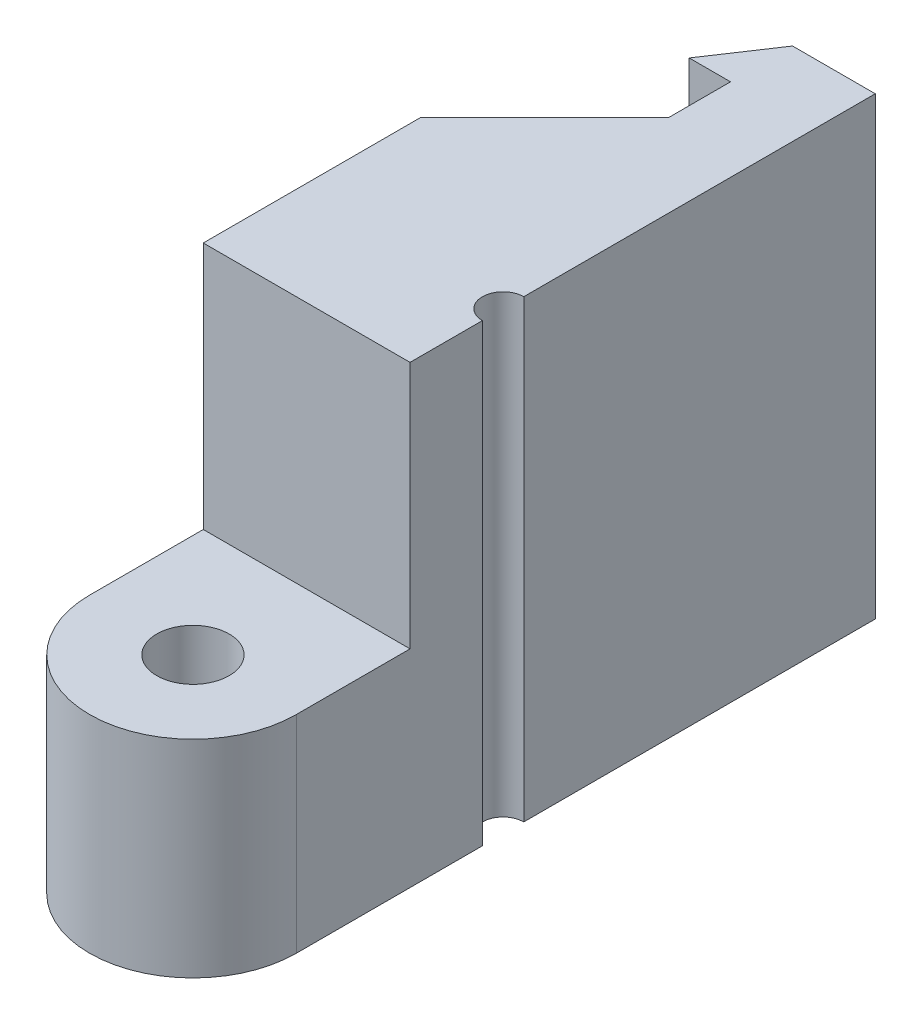
ISO-10303-21;
HEADER;
FILE_DESCRIPTION(('STEP AP214'),'2;1');
FILE_NAME('part.step','',(''),(''),'','','');
FILE_SCHEMA(('AUTOMOTIVE_DESIGN { 1 0 10303 214 1 1 1 1 }'));
ENDSEC;
DATA;
#1=APPLICATION_CONTEXT('core data for automotive mechanical design processes');
#2=APPLICATION_PROTOCOL_DEFINITION('international standard','automotive_design',2000,#1);
#3=PRODUCT_CONTEXT('',#1,'mechanical');
#4=PRODUCT('Part','Part','',(#3));
#5=PRODUCT_RELATED_PRODUCT_CATEGORY('part','',(#4));
#6=PRODUCT_DEFINITION_FORMATION('','',#4);
#7=PRODUCT_DEFINITION_CONTEXT('part definition',#1,'design');
#8=PRODUCT_DEFINITION('design','',#6,#7);
#9=PRODUCT_DEFINITION_SHAPE('','',#8);
#10=(LENGTH_UNIT() NAMED_UNIT(*) SI_UNIT(.MILLI.,.METRE.));
#11=(NAMED_UNIT(*) PLANE_ANGLE_UNIT() SI_UNIT($,.RADIAN.));
#12=(NAMED_UNIT(*) SI_UNIT($,.STERADIAN.) SOLID_ANGLE_UNIT());
#13=UNCERTAINTY_MEASURE_WITH_UNIT(LENGTH_MEASURE(1.E-05),#10,'distance_accuracy_value','');
#14=(GEOMETRIC_REPRESENTATION_CONTEXT(3) GLOBAL_UNCERTAINTY_ASSIGNED_CONTEXT((#13)) GLOBAL_UNIT_ASSIGNED_CONTEXT((#10,
#11,#12)) REPRESENTATION_CONTEXT('',''));
#15=CARTESIAN_POINT('',(0.,0.,0.));
#16=DIRECTION('',(0.,0.,1.));
#17=DIRECTION('',(1.,0.,0.));
#18=AXIS2_PLACEMENT_3D('',#15,#16,#17);
#19=CARTESIAN_POINT('',(5.,10.,-10.));
#20=DIRECTION('',(0.,-1.,0.));
#21=DIRECTION('',(0.,0.,-1.));
#22=AXIS2_PLACEMENT_3D('',#19,#20,#21);
#23=CYLINDRICAL_SURFACE('',#22,0.999999999999997);
#24=CARTESIAN_POINT('',(5.,0.,-10.));
#25=DIRECTION('',(0.,1.,0.));
#26=DIRECTION('',(0.,0.,1.));
#27=AXIS2_PLACEMENT_3D('',#24,#25,#26);
#28=CIRCLE('',#27,0.999999999999997);
#29=CARTESIAN_POINT('',(5.,0.,-11.));
#30=VERTEX_POINT('',#29);
#31=CARTESIAN_POINT('',(5.,0.,-9.));
#32=VERTEX_POINT('',#31);
#33=EDGE_CURVE('E214',#30,#32,#28,.T.);
#34=ORIENTED_EDGE('',*,*,#33,.F.);
#35=DIRECTION('',(0.,-1.,0.));
#36=VECTOR('',#35,1.);
#37=CARTESIAN_POINT('',(5.,10.,-11.));
#38=LINE('',#37,#36);
#39=CARTESIAN_POINT('',(5.,22.,-11.));
#40=VERTEX_POINT('',#39);
#41=EDGE_CURVE('E259',#40,#30,#38,.T.);
#42=ORIENTED_EDGE('',*,*,#41,.F.);
#43=CARTESIAN_POINT('',(5.,22.,-10.));
#44=DIRECTION('',(0.,-1.,0.));
#45=DIRECTION('',(0.,0.,1.));
#46=AXIS2_PLACEMENT_3D('',#43,#44,#45);
#47=CIRCLE('',#46,0.999999999999997);
#48=CARTESIAN_POINT('',(5.,22.,-9.));
#49=VERTEX_POINT('',#48);
#50=EDGE_CURVE('E145',#49,#40,#47,.T.);
#51=ORIENTED_EDGE('',*,*,#50,.F.);
#52=DIRECTION('',(0.,-1.,0.));
#53=VECTOR('',#52,1.);
#54=CARTESIAN_POINT('',(5.,10.,-9.));
#55=LINE('',#54,#53);
#56=EDGE_CURVE('E230',#49,#32,#55,.T.);
#57=ORIENTED_EDGE('',*,*,#56,.T.);
#58=EDGE_LOOP('',(#34,#42,#51,#57));
#59=FACE_BOUND('',#58,.T.);
#60=ADVANCED_FACE('F47',(#59),#23,.F.);
#61=CARTESIAN_POINT('',(5.,10.,0.));
#62=DIRECTION('',(-1.,0.,0.));
#63=DIRECTION('',(0.,0.,1.));
#64=AXIS2_PLACEMENT_3D('',#61,#62,#63);
#65=PLANE('',#64);
#66=DIRECTION('',(0.,0.,-1.));
#67=VECTOR('',#66,1.);
#68=CARTESIAN_POINT('',(5.,0.,0.));
#69=LINE('',#68,#67);
#70=CARTESIAN_POINT('',(5.,0.,-28.));
#71=VERTEX_POINT('',#70);
#72=EDGE_CURVE('E154',#30,#71,#69,.T.);
#73=ORIENTED_EDGE('',*,*,#72,.T.);
#74=DIRECTION('',(0.,1.,0.));
#75=VECTOR('',#74,1.);
#76=CARTESIAN_POINT('',(5.,-8.48528137423857,-28.));
#77=LINE('',#76,#75);
#78=CARTESIAN_POINT('',(5.,22.,-28.));
#79=VERTEX_POINT('',#78);
#80=EDGE_CURVE('E151',#71,#79,#77,.T.);
#81=ORIENTED_EDGE('',*,*,#80,.T.);
#82=DIRECTION('',(0.,0.,-1.));
#83=VECTOR('',#82,1.);
#84=CARTESIAN_POINT('',(5.,22.,-11.));
#85=LINE('',#84,#83);
#86=EDGE_CURVE('E137',#40,#79,#85,.T.);
#87=ORIENTED_EDGE('',*,*,#86,.F.);
#88=ORIENTED_EDGE('',*,*,#41,.T.);
#89=EDGE_LOOP('',(#73,#81,#87,#88));
#90=FACE_BOUND('',#89,.T.);
#91=ADVANCED_FACE('F152',(#90),#65,.F.);
#92=CARTESIAN_POINT('',(-5.,10.,0.));
#93=DIRECTION('',(-1.,0.,0.));
#94=DIRECTION('',(0.,0.,1.));
#95=AXIS2_PLACEMENT_3D('',#92,#93,#94);
#96=PLANE('',#95);
#97=DIRECTION('',(0.,0.,1.));
#98=VECTOR('',#97,1.);
#99=CARTESIAN_POINT('',(-5.,22.,-5.5));
#100=LINE('',#99,#98);
#101=CARTESIAN_POINT('',(-5.,22.,-16.));
#102=VERTEX_POINT('',#101);
#103=CARTESIAN_POINT('',(-5.,22.,-5.5));
#104=VERTEX_POINT('',#103);
#105=EDGE_CURVE('E148',#102,#104,#100,.T.);
#106=ORIENTED_EDGE('',*,*,#105,.F.);
#107=DIRECTION('',(0.,-1.,0.));
#108=VECTOR('',#107,1.);
#109=CARTESIAN_POINT('',(-5.,10.,-16.));
#110=LINE('',#109,#108);
#111=CARTESIAN_POINT('',(-5.,0.,-16.));
#112=VERTEX_POINT('',#111);
#113=EDGE_CURVE('E262',#102,#112,#110,.T.);
#114=ORIENTED_EDGE('',*,*,#113,.T.);
#115=DIRECTION('',(0.,0.,-1.));
#116=VECTOR('',#115,1.);
#117=CARTESIAN_POINT('',(-5.,0.,0.));
#118=LINE('',#117,#116);
#119=CARTESIAN_POINT('',(-5.,0.,0.));
#120=VERTEX_POINT('',#119);
#121=EDGE_CURVE('E236',#120,#112,#118,.T.);
#122=ORIENTED_EDGE('',*,*,#121,.F.);
#123=DIRECTION('',(0.,-1.,0.));
#124=VECTOR('',#123,1.);
#125=CARTESIAN_POINT('',(-5.,10.,0.));
#126=LINE('',#125,#124);
#127=CARTESIAN_POINT('',(-5.,10.,0.));
#128=VERTEX_POINT('',#127);
#129=EDGE_CURVE('E256',#128,#120,#126,.T.);
#130=ORIENTED_EDGE('',*,*,#129,.F.);
#131=DIRECTION('',(0.,0.,-1.));
#132=VECTOR('',#131,1.);
#133=CARTESIAN_POINT('',(-5.,10.,0.));
#134=LINE('',#133,#132);
#135=CARTESIAN_POINT('',(-5.,10.,-5.5));
#136=VERTEX_POINT('',#135);
#137=EDGE_CURVE('E215',#128,#136,#134,.T.);
#138=ORIENTED_EDGE('',*,*,#137,.T.);
#139=DIRECTION('',(0.,-1.,0.));
#140=VECTOR('',#139,1.);
#141=CARTESIAN_POINT('',(-5.,22.,-5.5));
#142=LINE('',#141,#140);
#143=EDGE_CURVE('E210',#104,#136,#142,.T.);
#144=ORIENTED_EDGE('',*,*,#143,.F.);
#145=EDGE_LOOP('',(#106,#114,#122,#130,#138,#144));
#146=FACE_BOUND('',#145,.T.);
#147=ADVANCED_FACE('F279',(#146),#96,.T.);
#148=CARTESIAN_POINT('',(0.,10.,0.));
#149=DIRECTION('',(0.,-1.,0.));
#150=DIRECTION('',(0.,0.,-1.));
#151=AXIS2_PLACEMENT_3D('',#148,#149,#150);
#152=CYLINDRICAL_SURFACE('',#151,5.);
#153=CARTESIAN_POINT('',(0.,0.,0.));
#154=DIRECTION('',(0.,1.,0.));
#155=DIRECTION('',(0.,0.,1.));
#156=AXIS2_PLACEMENT_3D('',#153,#154,#155);
#157=CIRCLE('',#156,5.);
#158=CARTESIAN_POINT('',(5.,0.,0.));
#159=VERTEX_POINT('',#158);
#160=EDGE_CURVE('E240',#120,#159,#157,.T.);
#161=ORIENTED_EDGE('',*,*,#160,.T.);
#162=DIRECTION('',(0.,-1.,0.));
#163=VECTOR('',#162,1.);
#164=CARTESIAN_POINT('',(5.,10.,0.));
#165=LINE('',#164,#163);
#166=CARTESIAN_POINT('',(5.,10.,0.));
#167=VERTEX_POINT('',#166);
#168=EDGE_CURVE('E252',#167,#159,#165,.T.);
#169=ORIENTED_EDGE('',*,*,#168,.F.);
#170=CARTESIAN_POINT('',(0.,10.,0.));
#171=DIRECTION('',(0.,1.,0.));
#172=DIRECTION('',(0.,0.,1.));
#173=AXIS2_PLACEMENT_3D('',#170,#171,#172);
#174=CIRCLE('',#173,5.);
#175=EDGE_CURVE('E219',#128,#167,#174,.T.);
#176=ORIENTED_EDGE('',*,*,#175,.F.);
#177=ORIENTED_EDGE('',*,*,#129,.T.);
#178=EDGE_LOOP('',(#161,#169,#176,#177));
#179=FACE_BOUND('',#178,.T.);
#180=ADVANCED_FACE('F321',(#179),#152,.T.);
#181=CARTESIAN_POINT('',(5.,10.,0.));
#182=DIRECTION('',(-1.,0.,0.));
#183=DIRECTION('',(0.,0.,1.));
#184=AXIS2_PLACEMENT_3D('',#181,#182,#183);
#185=PLANE('',#184);
#186=DIRECTION('',(0.,0.,-1.));
#187=VECTOR('',#186,1.);
#188=CARTESIAN_POINT('',(5.,0.,0.));
#189=LINE('',#188,#187);
#190=EDGE_CURVE('E243',#159,#32,#189,.T.);
#191=ORIENTED_EDGE('',*,*,#190,.T.);
#192=ORIENTED_EDGE('',*,*,#56,.F.);
#193=DIRECTION('',(0.,0.,-1.));
#194=VECTOR('',#193,1.);
#195=CARTESIAN_POINT('',(5.,22.,-5.5));
#196=LINE('',#195,#194);
#197=CARTESIAN_POINT('',(5.,22.,-5.5));
#198=VERTEX_POINT('',#197);
#199=EDGE_CURVE('E192',#198,#49,#196,.T.);
#200=ORIENTED_EDGE('',*,*,#199,.F.);
#201=DIRECTION('',(0.,-1.,0.));
#202=VECTOR('',#201,1.);
#203=CARTESIAN_POINT('',(5.,22.,-5.5));
#204=LINE('',#203,#202);
#205=CARTESIAN_POINT('',(5.,10.,-5.5));
#206=VERTEX_POINT('',#205);
#207=EDGE_CURVE('E203',#198,#206,#204,.T.);
#208=ORIENTED_EDGE('',*,*,#207,.T.);
#209=DIRECTION('',(0.,0.,-1.));
#210=VECTOR('',#209,1.);
#211=CARTESIAN_POINT('',(5.,10.,0.));
#212=LINE('',#211,#210);
#213=EDGE_CURVE('E223',#167,#206,#212,.T.);
#214=ORIENTED_EDGE('',*,*,#213,.F.);
#215=ORIENTED_EDGE('',*,*,#168,.T.);
#216=EDGE_LOOP('',(#191,#192,#200,#208,#214,#215));
#217=FACE_BOUND('',#216,.T.);
#218=ADVANCED_FACE('F288',(#217),#185,.F.);
#219=CARTESIAN_POINT('',(0.,10.,0.));
#220=DIRECTION('',(0.,-1.,0.));
#221=DIRECTION('',(0.,0.,-1.));
#222=AXIS2_PLACEMENT_3D('',#219,#220,#221);
#223=CYLINDRICAL_SURFACE('',#222,1.75);
#224=CARTESIAN_POINT('',(0.,10.,0.));
#225=DIRECTION('',(0.,1.,0.));
#226=DIRECTION('',(0.,0.,1.));
#227=AXIS2_PLACEMENT_3D('',#224,#225,#226);
#228=CIRCLE('',#227,1.75);
#229=CARTESIAN_POINT('',(0.,10.,1.75));
#230=VERTEX_POINT('',#229);
#231=EDGE_CURVE('E226',#230,#230,#228,.T.);
#232=ORIENTED_EDGE('',*,*,#231,.T.);
#233=EDGE_LOOP('',(#232));
#234=FACE_BOUND('',#233,.T.);
#235=CARTESIAN_POINT('',(0.,0.,0.));
#236=DIRECTION('',(0.,1.,0.));
#237=DIRECTION('',(0.,0.,1.));
#238=AXIS2_PLACEMENT_3D('',#235,#236,#237);
#239=CIRCLE('',#238,1.75);
#240=CARTESIAN_POINT('',(0.,0.,1.75));
#241=VERTEX_POINT('',#240);
#242=EDGE_CURVE('E220',#241,#241,#239,.T.);
#243=ORIENTED_EDGE('',*,*,#242,.F.);
#244=EDGE_LOOP('',(#243));
#245=FACE_BOUND('',#244,.T.);
#246=ADVANCED_FACE('F327',(#234,#245),#223,.F.);
#247=CARTESIAN_POINT('',(0.,10.,0.));
#248=DIRECTION('',(0.,1.,0.));
#249=DIRECTION('',(0.,0.,1.));
#250=AXIS2_PLACEMENT_3D('',#247,#248,#249);
#251=PLANE('',#250);
#252=DIRECTION('',(1.,0.,0.));
#253=VECTOR('',#252,1.);
#254=CARTESIAN_POINT('',(5.,10.,-5.5));
#255=LINE('',#254,#253);
#256=EDGE_CURVE('E195',#136,#206,#255,.T.);
#257=ORIENTED_EDGE('',*,*,#256,.F.);
#258=ORIENTED_EDGE('',*,*,#137,.F.);
#259=ORIENTED_EDGE('',*,*,#175,.T.);
#260=ORIENTED_EDGE('',*,*,#213,.T.);
#261=EDGE_LOOP('',(#257,#258,#259,#260));
#262=FACE_BOUND('',#261,.T.);
#263=ORIENTED_EDGE('',*,*,#231,.F.);
#264=EDGE_LOOP('',(#263));
#265=FACE_BOUND('',#264,.T.);
#266=ADVANCED_FACE('F330',(#262,#265),#251,.T.);
#267=CARTESIAN_POINT('',(0.,0.,0.));
#268=DIRECTION('',(0.,1.,0.));
#269=DIRECTION('',(0.,0.,1.));
#270=AXIS2_PLACEMENT_3D('',#267,#268,#269);
#271=PLANE('',#270);
#272=ORIENTED_EDGE('',*,*,#121,.T.);
#273=DIRECTION('',(-0.707106781186549,0.,0.707106781186546));
#274=VECTOR('',#273,1.);
#275=CARTESIAN_POINT('',(-5.,0.,-16.));
#276=LINE('',#275,#274);
#277=CARTESIAN_POINT('',(1.,0.,-22.));
#278=VERTEX_POINT('',#277);
#279=EDGE_CURVE('E57',#112,#278,#276,.F.);
#280=ORIENTED_EDGE('',*,*,#279,.T.);
#281=DIRECTION('',(0.,0.,-1.));
#282=VECTOR('',#281,1.);
#283=CARTESIAN_POINT('',(0.999999999999999,0.,-25.));
#284=LINE('',#283,#282);
#285=CARTESIAN_POINT('',(0.999999999999999,0.,-25.));
#286=VERTEX_POINT('',#285);
#287=EDGE_CURVE('E172',#278,#286,#284,.T.);
#288=ORIENTED_EDGE('',*,*,#287,.T.);
#289=DIRECTION('',(-1.,0.,0.));
#290=VECTOR('',#289,1.);
#291=CARTESIAN_POINT('',(-1.,0.,-25.));
#292=LINE('',#291,#290);
#293=CARTESIAN_POINT('',(-1.,0.,-25.));
#294=VERTEX_POINT('',#293);
#295=EDGE_CURVE('E277',#286,#294,#292,.T.);
#296=ORIENTED_EDGE('',*,*,#295,.T.);
#297=DIRECTION('',(0.554700196225229,0.,-0.832050294337844));
#298=VECTOR('',#297,1.);
#299=CARTESIAN_POINT('',(0.999999999999999,0.,-28.));
#300=LINE('',#299,#298);
#301=CARTESIAN_POINT('',(0.999999999999999,0.,-28.));
#302=VERTEX_POINT('',#301);
#303=EDGE_CURVE('E293',#294,#302,#300,.T.);
#304=ORIENTED_EDGE('',*,*,#303,.T.);
#305=DIRECTION('',(1.,0.,0.));
#306=VECTOR('',#305,1.);
#307=CARTESIAN_POINT('',(5.,0.,-28.));
#308=LINE('',#307,#306);
#309=EDGE_CURVE('E183',#302,#71,#308,.T.);
#310=ORIENTED_EDGE('',*,*,#309,.T.);
#311=ORIENTED_EDGE('',*,*,#72,.F.);
#312=ORIENTED_EDGE('',*,*,#33,.T.);
#313=ORIENTED_EDGE('',*,*,#190,.F.);
#314=ORIENTED_EDGE('',*,*,#160,.F.);
#315=EDGE_LOOP('',(#272,#280,#288,#296,#304,#310,#311,#312,#313,#314));
#316=FACE_BOUND('',#315,.T.);
#317=ORIENTED_EDGE('',*,*,#242,.T.);
#318=EDGE_LOOP('',(#317));
#319=FACE_BOUND('',#318,.T.);
#320=ADVANCED_FACE('F267',(#316,#319),#271,.F.);
#321=CARTESIAN_POINT('',(5.,22.,-5.5));
#322=DIRECTION('',(0.,0.,-1.));
#323=DIRECTION('',(-1.,0.,0.));
#324=AXIS2_PLACEMENT_3D('',#321,#322,#323);
#325=PLANE('',#324);
#326=ORIENTED_EDGE('',*,*,#256,.T.);
#327=ORIENTED_EDGE('',*,*,#207,.F.);
#328=DIRECTION('',(1.,0.,0.));
#329=VECTOR('',#328,1.);
#330=CARTESIAN_POINT('',(5.,22.,-5.5));
#331=LINE('',#330,#329);
#332=EDGE_CURVE('E200',#104,#198,#331,.T.);
#333=ORIENTED_EDGE('',*,*,#332,.F.);
#334=ORIENTED_EDGE('',*,*,#143,.T.);
#335=EDGE_LOOP('',(#326,#327,#333,#334));
#336=FACE_BOUND('',#335,.T.);
#337=ADVANCED_FACE('F285',(#336),#325,.F.);
#338=CARTESIAN_POINT('',(5.,22.,-10.));
#339=DIRECTION('',(0.,1.,0.));
#340=DIRECTION('',(0.,0.,1.));
#341=AXIS2_PLACEMENT_3D('',#338,#339,#340);
#342=PLANE('',#341);
#343=DIRECTION('',(0.,0.,1.));
#344=VECTOR('',#343,1.);
#345=CARTESIAN_POINT('',(0.999999999999999,22.,-25.));
#346=LINE('',#345,#344);
#347=CARTESIAN_POINT('',(0.999999999999999,22.,-25.));
#348=VERTEX_POINT('',#347);
#349=CARTESIAN_POINT('',(1.,22.,-22.));
#350=VERTEX_POINT('',#349);
#351=EDGE_CURVE('E160',#348,#350,#346,.T.);
#352=ORIENTED_EDGE('',*,*,#351,.T.);
#353=DIRECTION('',(0.707106781186549,0.,-0.707106781186546));
#354=VECTOR('',#353,1.);
#355=CARTESIAN_POINT('',(-2.99999999999998,22.,-18.));
#356=LINE('',#355,#354);
#357=EDGE_CURVE('E11',#350,#102,#356,.F.);
#358=ORIENTED_EDGE('',*,*,#357,.T.);
#359=ORIENTED_EDGE('',*,*,#105,.T.);
#360=ORIENTED_EDGE('',*,*,#332,.T.);
#361=ORIENTED_EDGE('',*,*,#199,.T.);
#362=ORIENTED_EDGE('',*,*,#50,.T.);
#363=ORIENTED_EDGE('',*,*,#86,.T.);
#364=DIRECTION('',(-1.,0.,0.));
#365=VECTOR('',#364,1.);
#366=CARTESIAN_POINT('',(5.,22.,-28.));
#367=LINE('',#366,#365);
#368=CARTESIAN_POINT('',(0.999999999999999,22.,-28.));
#369=VERTEX_POINT('',#368);
#370=EDGE_CURVE('E142',#79,#369,#367,.T.);
#371=ORIENTED_EDGE('',*,*,#370,.T.);
#372=DIRECTION('',(-0.554700196225229,0.,0.832050294337844));
#373=VECTOR('',#372,1.);
#374=CARTESIAN_POINT('',(0.999999999999999,22.,-28.));
#375=LINE('',#374,#373);
#376=CARTESIAN_POINT('',(-1.,22.,-25.));
#377=VERTEX_POINT('',#376);
#378=EDGE_CURVE('E166',#369,#377,#375,.T.);
#379=ORIENTED_EDGE('',*,*,#378,.T.);
#380=DIRECTION('',(1.,0.,0.));
#381=VECTOR('',#380,1.);
#382=CARTESIAN_POINT('',(-1.,22.,-25.));
#383=LINE('',#382,#381);
#384=EDGE_CURVE('E169',#377,#348,#383,.T.);
#385=ORIENTED_EDGE('',*,*,#384,.T.);
#386=EDGE_LOOP('',(#352,#358,#359,#360,#361,#362,#363,#371,#379,#385));
#387=FACE_BOUND('',#386,.T.);
#388=ADVANCED_FACE('F139',(#387),#342,.T.);
#389=CARTESIAN_POINT('',(0.999999999999999,-8.48528137423857,-25.));
#390=DIRECTION('',(-1.,0.,0.));
#391=DIRECTION('',(0.,0.,1.));
#392=AXIS2_PLACEMENT_3D('',#389,#390,#391);
#393=PLANE('',#392);
#394=ORIENTED_EDGE('',*,*,#287,.F.);
#395=DIRECTION('',(0.,1.,0.));
#396=VECTOR('',#395,1.);
#397=CARTESIAN_POINT('',(1.,-8.48528137423857,-22.));
#398=LINE('',#397,#396);
#399=EDGE_CURVE('E180',#278,#350,#398,.T.);
#400=ORIENTED_EDGE('',*,*,#399,.T.);
#401=ORIENTED_EDGE('',*,*,#351,.F.);
#402=DIRECTION('',(0.,1.,0.));
#403=VECTOR('',#402,1.);
#404=CARTESIAN_POINT('',(0.999999999999999,-8.48528137423857,-25.));
#405=LINE('',#404,#403);
#406=EDGE_CURVE('E184',#286,#348,#405,.T.);
#407=ORIENTED_EDGE('',*,*,#406,.F.);
#408=EDGE_LOOP('',(#394,#400,#401,#407));
#409=FACE_BOUND('',#408,.T.);
#410=ADVANCED_FACE('F274',(#409),#393,.T.);
#411=CARTESIAN_POINT('',(-1.,-8.48528137423857,-25.));
#412=DIRECTION('',(0.,0.,1.));
#413=DIRECTION('',(1.,0.,0.));
#414=AXIS2_PLACEMENT_3D('',#411,#412,#413);
#415=PLANE('',#414);
#416=ORIENTED_EDGE('',*,*,#295,.F.);
#417=ORIENTED_EDGE('',*,*,#406,.T.);
#418=ORIENTED_EDGE('',*,*,#384,.F.);
#419=DIRECTION('',(0.,1.,0.));
#420=VECTOR('',#419,1.);
#421=CARTESIAN_POINT('',(-1.,-8.48528137423857,-25.));
#422=LINE('',#421,#420);
#423=EDGE_CURVE('E187',#294,#377,#422,.T.);
#424=ORIENTED_EDGE('',*,*,#423,.F.);
#425=EDGE_LOOP('',(#416,#417,#418,#424));
#426=FACE_BOUND('',#425,.T.);
#427=ADVANCED_FACE('F304',(#426),#415,.T.);
#428=CARTESIAN_POINT('',(0.999999999999999,-8.48528137423857,-28.));
#429=DIRECTION('',(-0.832050294337844,0.,-0.554700196225229));
#430=DIRECTION('',(-0.554700196225229,0.,0.832050294337844));
#431=AXIS2_PLACEMENT_3D('',#428,#429,#430);
#432=PLANE('',#431);
#433=ORIENTED_EDGE('',*,*,#303,.F.);
#434=ORIENTED_EDGE('',*,*,#423,.T.);
#435=ORIENTED_EDGE('',*,*,#378,.F.);
#436=DIRECTION('',(0.,1.,0.));
#437=VECTOR('',#436,1.);
#438=CARTESIAN_POINT('',(0.999999999999999,-8.48528137423857,-28.));
#439=LINE('',#438,#437);
#440=EDGE_CURVE('E159',#302,#369,#439,.T.);
#441=ORIENTED_EDGE('',*,*,#440,.F.);
#442=EDGE_LOOP('',(#433,#434,#435,#441));
#443=FACE_BOUND('',#442,.T.);
#444=ADVANCED_FACE('F302',(#443),#432,.T.);
#445=CARTESIAN_POINT('',(5.,-8.48528137423857,-28.));
#446=DIRECTION('',(0.,0.,-1.));
#447=DIRECTION('',(-1.,0.,0.));
#448=AXIS2_PLACEMENT_3D('',#445,#446,#447);
#449=PLANE('',#448);
#450=ORIENTED_EDGE('',*,*,#309,.F.);
#451=ORIENTED_EDGE('',*,*,#440,.T.);
#452=ORIENTED_EDGE('',*,*,#370,.F.);
#453=ORIENTED_EDGE('',*,*,#80,.F.);
#454=EDGE_LOOP('',(#450,#451,#452,#453));
#455=FACE_BOUND('',#454,.T.);
#456=ADVANCED_FACE('F162',(#455),#449,.T.);
#457=CARTESIAN_POINT('',(-5.,10.,-16.));
#458=DIRECTION('',(0.707106781186546,0.,0.707106781186549));
#459=DIRECTION('',(0.,-1.,0.));
#460=AXIS2_PLACEMENT_3D('',#457,#458,#459);
#461=PLANE('',#460);
#462=ORIENTED_EDGE('',*,*,#357,.F.);
#463=ORIENTED_EDGE('',*,*,#399,.F.);
#464=ORIENTED_EDGE('',*,*,#279,.F.);
#465=ORIENTED_EDGE('',*,*,#113,.F.);
#466=EDGE_LOOP('',(#462,#463,#464,#465));
#467=FACE_BOUND('',#466,.T.);
#468=ADVANCED_FACE('F50',(#467),#461,.F.);
#469=CLOSED_SHELL('',(#60,#91,#147,#180,#218,#246,#266,#320,#337,#388,#410,#427,#444,#456,#468));
#470=MANIFOLD_SOLID_BREP('B2',#469);
#471=ADVANCED_BREP_SHAPE_REPRESENTATION('',(#18,#470),#14);
#472=SHAPE_DEFINITION_REPRESENTATION(#9,#471);
ENDSEC;
END-ISO-10303-21;
